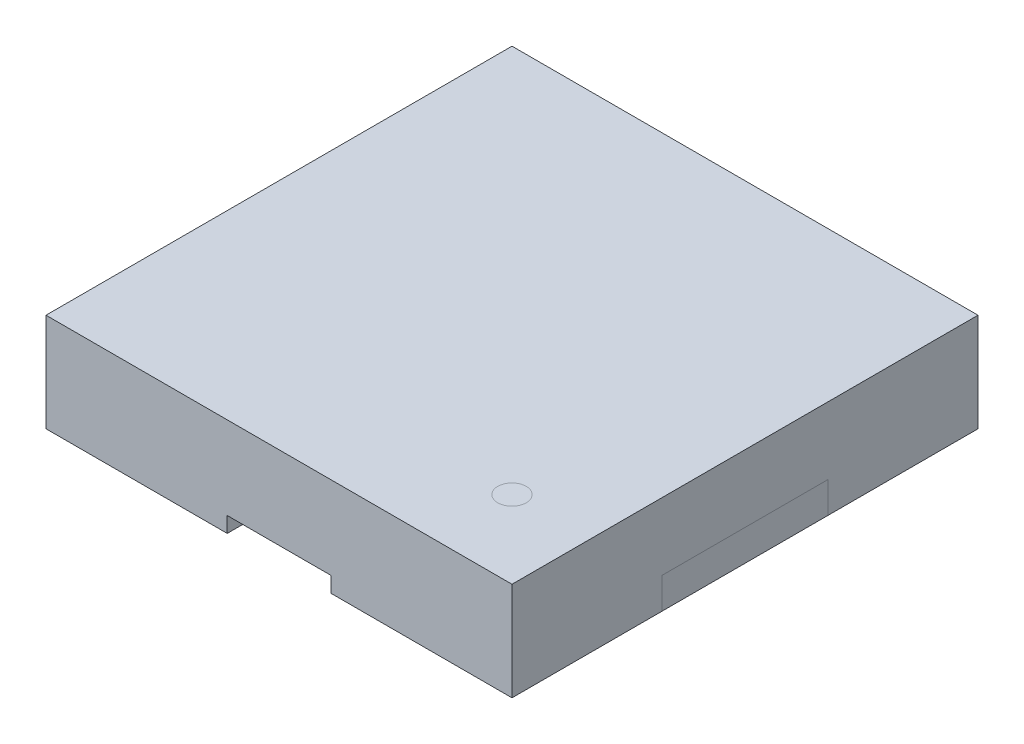
ISO-10303-21;
HEADER;
FILE_DESCRIPTION(('STEP AP214'),'2;1');
FILE_NAME('part.step','',(''),(''),'','','');
FILE_SCHEMA(('AUTOMOTIVE_DESIGN { 1 0 10303 214 1 1 1 1 }'));
ENDSEC;
DATA;
#1=APPLICATION_CONTEXT('core data for automotive mechanical design processes');
#2=APPLICATION_PROTOCOL_DEFINITION('international standard','automotive_design',2000,#1);
#3=PRODUCT_CONTEXT('',#1,'mechanical');
#4=PRODUCT('Part','Part','',(#3));
#5=PRODUCT_RELATED_PRODUCT_CATEGORY('part','',(#4));
#6=PRODUCT_DEFINITION_FORMATION('','',#4);
#7=PRODUCT_DEFINITION_CONTEXT('part definition',#1,'design');
#8=PRODUCT_DEFINITION('design','',#6,#7);
#9=PRODUCT_DEFINITION_SHAPE('','',#8);
#10=(LENGTH_UNIT() NAMED_UNIT(*) SI_UNIT(.MILLI.,.METRE.));
#11=(NAMED_UNIT(*) PLANE_ANGLE_UNIT() SI_UNIT($,.RADIAN.));
#12=(NAMED_UNIT(*) SI_UNIT($,.STERADIAN.) SOLID_ANGLE_UNIT());
#13=UNCERTAINTY_MEASURE_WITH_UNIT(LENGTH_MEASURE(1.E-05),#10,'distance_accuracy_value','');
#14=(GEOMETRIC_REPRESENTATION_CONTEXT(3) GLOBAL_UNCERTAINTY_ASSIGNED_CONTEXT((#13)) GLOBAL_UNIT_ASSIGNED_CONTEXT((#10,
#11,#12)) REPRESENTATION_CONTEXT('',''));
#15=CARTESIAN_POINT('',(0.,0.,0.));
#16=DIRECTION('',(0.,0.,1.));
#17=DIRECTION('',(1.,0.,0.));
#18=AXIS2_PLACEMENT_3D('',#15,#16,#17);
#19=CARTESIAN_POINT('',(-3.5,0.6,1.6));
#20=DIRECTION('',(-1.,0.,0.));
#21=DIRECTION('',(0.,0.,1.));
#22=AXIS2_PLACEMENT_3D('',#19,#20,#21);
#23=PLANE('',#22);
#24=DIRECTION('',(0.,0.,1.));
#25=VECTOR('',#24,1.);
#26=CARTESIAN_POINT('',(-3.5,0.6,-1.6));
#27=LINE('',#26,#25);
#28=CARTESIAN_POINT('',(-3.5,0.6,1.6));
#29=VERTEX_POINT('',#28);
#30=CARTESIAN_POINT('',(-3.50000000000001,0.6,-1.6));
#31=VERTEX_POINT('',#30);
#32=EDGE_CURVE('P0_E377',#29,#31,#27,.F.);
#33=ORIENTED_EDGE('',*,*,#32,.T.);
#34=DIRECTION('',(0.,1.,0.));
#35=VECTOR('',#34,1.);
#36=CARTESIAN_POINT('',(-3.5,0.6,-1.6));
#37=LINE('',#36,#35);
#38=CARTESIAN_POINT('',(-3.50000000000001,0.,-1.6));
#39=VERTEX_POINT('',#38);
#40=EDGE_CURVE('P0_E374',#39,#31,#37,.T.);
#41=ORIENTED_EDGE('',*,*,#40,.F.);
#42=DIRECTION('',(0.,0.,-1.));
#43=VECTOR('',#42,1.);
#44=CARTESIAN_POINT('',(-3.5,0.,-4.5));
#45=LINE('',#44,#43);
#46=CARTESIAN_POINT('',(-3.5,0.,1.6));
#47=VERTEX_POINT('',#46);
#48=EDGE_CURVE('P0_E347',#47,#39,#45,.T.);
#49=ORIENTED_EDGE('',*,*,#48,.F.);
#50=DIRECTION('',(0.,1.,0.));
#51=VECTOR('',#50,1.);
#52=CARTESIAN_POINT('',(-3.5,0.6,1.6));
#53=LINE('',#52,#51);
#54=EDGE_CURVE('P0_E209',#29,#47,#53,.F.);
#55=ORIENTED_EDGE('',*,*,#54,.F.);
#56=EDGE_LOOP('',(#33,#41,#49,#55));
#57=FACE_BOUND('',#56,.T.);
#58=ADVANCED_FACE('P0_F17',(#57),#23,.T.);
#59=CARTESIAN_POINT('',(-1.,0.3,-6.));
#60=DIRECTION('',(1.,0.,0.));
#61=DIRECTION('',(0.,0.,-1.));
#62=AXIS2_PLACEMENT_3D('',#59,#60,#61);
#63=PLANE('',#62);
#64=DIRECTION('',(0.,1.,0.));
#65=VECTOR('',#64,1.);
#66=CARTESIAN_POINT('',(-1.,0.3,-3.));
#67=LINE('',#66,#65);
#68=CARTESIAN_POINT('',(-1.,0.,-3.));
#69=VERTEX_POINT('',#68);
#70=CARTESIAN_POINT('',(-1.,0.3,-3.));
#71=VERTEX_POINT('',#70);
#72=EDGE_CURVE('P0_E227',#69,#71,#67,.T.);
#73=ORIENTED_EDGE('',*,*,#72,.F.);
#74=DIRECTION('',(0.,0.,-1.));
#75=VECTOR('',#74,1.);
#76=CARTESIAN_POINT('',(-1.,0.,-4.5));
#77=LINE('',#76,#75);
#78=CARTESIAN_POINT('',(-1.,0.,-4.5));
#79=VERTEX_POINT('',#78);
#80=EDGE_CURVE('P0_E341',#79,#69,#77,.F.);
#81=ORIENTED_EDGE('',*,*,#80,.F.);
#82=DIRECTION('',(0.,1.,0.));
#83=VECTOR('',#82,1.);
#84=CARTESIAN_POINT('',(-1.,0.3,-4.5));
#85=LINE('',#84,#83);
#86=CARTESIAN_POINT('',(-1.,0.3,-4.5));
#87=VERTEX_POINT('',#86);
#88=EDGE_CURVE('P0_E230',#79,#87,#85,.T.);
#89=ORIENTED_EDGE('',*,*,#88,.T.);
#90=DIRECTION('',(0.,0.,-1.));
#91=VECTOR('',#90,1.);
#92=CARTESIAN_POINT('',(-1.,0.3,-6.));
#93=LINE('',#92,#91);
#94=EDGE_CURVE('P0_E360',#71,#87,#93,.T.);
#95=ORIENTED_EDGE('',*,*,#94,.F.);
#96=EDGE_LOOP('',(#73,#81,#89,#95));
#97=FACE_BOUND('',#96,.T.);
#98=ADVANCED_FACE('P0_F449',(#97),#63,.T.);
#99=CARTESIAN_POINT('',(-1.,0.3,-3.));
#100=DIRECTION('',(0.,0.,-1.));
#101=DIRECTION('',(-1.,0.,0.));
#102=AXIS2_PLACEMENT_3D('',#99,#100,#101);
#103=PLANE('',#102);
#104=DIRECTION('',(1.,0.,0.));
#105=VECTOR('',#104,1.);
#106=CARTESIAN_POINT('',(1.,0.3,-3.));
#107=LINE('',#106,#105);
#108=CARTESIAN_POINT('',(1.,0.3,-3.));
#109=VERTEX_POINT('',#108);
#110=EDGE_CURVE('P0_E363',#109,#71,#107,.F.);
#111=ORIENTED_EDGE('',*,*,#110,.F.);
#112=DIRECTION('',(0.,1.,0.));
#113=VECTOR('',#112,1.);
#114=CARTESIAN_POINT('',(1.,0.3,-3.));
#115=LINE('',#114,#113);
#116=CARTESIAN_POINT('',(1.,0.,-3.));
#117=VERTEX_POINT('',#116);
#118=EDGE_CURVE('P0_E221',#117,#109,#115,.T.);
#119=ORIENTED_EDGE('',*,*,#118,.F.);
#120=DIRECTION('',(1.,0.,0.));
#121=VECTOR('',#120,1.);
#122=CARTESIAN_POINT('',(4.5,0.,-3.));
#123=LINE('',#122,#121);
#124=EDGE_CURVE('P0_E338',#69,#117,#123,.T.);
#125=ORIENTED_EDGE('',*,*,#124,.F.);
#126=ORIENTED_EDGE('',*,*,#72,.T.);
#127=EDGE_LOOP('',(#111,#119,#125,#126));
#128=FACE_BOUND('',#127,.T.);
#129=ADVANCED_FACE('P0_F453',(#128),#103,.T.);
#130=CARTESIAN_POINT('',(1.,0.3,-6.));
#131=DIRECTION('',(-1.,0.,0.));
#132=DIRECTION('',(0.,0.,1.));
#133=AXIS2_PLACEMENT_3D('',#130,#131,#132);
#134=PLANE('',#133);
#135=ORIENTED_EDGE('',*,*,#118,.T.);
#136=DIRECTION('',(0.,0.,-1.));
#137=VECTOR('',#136,1.);
#138=CARTESIAN_POINT('',(1.,0.3,-6.));
#139=LINE('',#138,#137);
#140=CARTESIAN_POINT('',(1.,0.3,-4.5));
#141=VERTEX_POINT('',#140);
#142=EDGE_CURVE('P0_E367',#141,#109,#139,.F.);
#143=ORIENTED_EDGE('',*,*,#142,.F.);
#144=DIRECTION('',(0.,1.,0.));
#145=VECTOR('',#144,1.);
#146=CARTESIAN_POINT('',(1.,0.3,-4.5));
#147=LINE('',#146,#145);
#148=CARTESIAN_POINT('',(1.,0.,-4.5));
#149=VERTEX_POINT('',#148);
#150=EDGE_CURVE('P0_E224',#141,#149,#147,.F.);
#151=ORIENTED_EDGE('',*,*,#150,.T.);
#152=DIRECTION('',(0.,0.,-1.));
#153=VECTOR('',#152,1.);
#154=CARTESIAN_POINT('',(1.,0.,-4.5));
#155=LINE('',#154,#153);
#156=EDGE_CURVE('P0_E334',#117,#149,#155,.T.);
#157=ORIENTED_EDGE('',*,*,#156,.F.);
#158=EDGE_LOOP('',(#135,#143,#151,#157));
#159=FACE_BOUND('',#158,.T.);
#160=ADVANCED_FACE('P0_F441',(#159),#134,.T.);
#161=CARTESIAN_POINT('',(3.5,0.6,1.6));
#162=DIRECTION('',(1.,0.,0.));
#163=DIRECTION('',(0.,0.,-1.));
#164=AXIS2_PLACEMENT_3D('',#161,#162,#163);
#165=PLANE('',#164);
#166=DIRECTION('',(0.,0.,-1.));
#167=VECTOR('',#166,1.);
#168=CARTESIAN_POINT('',(3.5,0.6,-1.6));
#169=LINE('',#168,#167);
#170=CARTESIAN_POINT('',(3.5,0.6,1.6));
#171=VERTEX_POINT('',#170);
#172=CARTESIAN_POINT('',(3.5,0.6,-1.6));
#173=VERTEX_POINT('',#172);
#174=EDGE_CURVE('P0_E356',#171,#173,#169,.T.);
#175=ORIENTED_EDGE('',*,*,#174,.F.);
#176=DIRECTION('',(0.,1.,0.));
#177=VECTOR('',#176,1.);
#178=CARTESIAN_POINT('',(3.5,0.6,1.6));
#179=LINE('',#178,#177);
#180=CARTESIAN_POINT('',(3.5,0.,1.6));
#181=VERTEX_POINT('',#180);
#182=EDGE_CURVE('P0_E353',#181,#171,#179,.T.);
#183=ORIENTED_EDGE('',*,*,#182,.F.);
#184=DIRECTION('',(0.,0.,-1.));
#185=VECTOR('',#184,1.);
#186=CARTESIAN_POINT('',(3.5,0.,-4.5));
#187=LINE('',#186,#185);
#188=CARTESIAN_POINT('',(3.5,0.,-1.6));
#189=VERTEX_POINT('',#188);
#190=EDGE_CURVE('P0_E331',#189,#181,#187,.F.);
#191=ORIENTED_EDGE('',*,*,#190,.F.);
#192=DIRECTION('',(0.,1.,0.));
#193=VECTOR('',#192,1.);
#194=CARTESIAN_POINT('',(3.5,0.6,-1.6));
#195=LINE('',#194,#193);
#196=EDGE_CURVE('P0_E218',#189,#173,#195,.T.);
#197=ORIENTED_EDGE('',*,*,#196,.T.);
#198=EDGE_LOOP('',(#175,#183,#191,#197));
#199=FACE_BOUND('',#198,.T.);
#200=ADVANCED_FACE('P0_F435',(#199),#165,.T.);
#201=CARTESIAN_POINT('',(1.,0.3,6.));
#202=DIRECTION('',(-1.,0.,0.));
#203=DIRECTION('',(0.,0.,1.));
#204=AXIS2_PLACEMENT_3D('',#201,#202,#203);
#205=PLANE('',#204);
#206=DIRECTION('',(0.,1.,0.));
#207=VECTOR('',#206,1.);
#208=CARTESIAN_POINT('',(1.,0.3,3.));
#209=LINE('',#208,#207);
#210=CARTESIAN_POINT('',(1.,0.,3.));
#211=VERTEX_POINT('',#210);
#212=CARTESIAN_POINT('',(1.,0.3,3.));
#213=VERTEX_POINT('',#212);
#214=EDGE_CURVE('P0_E178',#211,#213,#209,.T.);
#215=ORIENTED_EDGE('',*,*,#214,.F.);
#216=DIRECTION('',(0.,0.,-1.));
#217=VECTOR('',#216,1.);
#218=CARTESIAN_POINT('',(1.,0.,-4.5));
#219=LINE('',#218,#217);
#220=CARTESIAN_POINT('',(1.,0.,4.5));
#221=VERTEX_POINT('',#220);
#222=EDGE_CURVE('P0_E326',#221,#211,#219,.T.);
#223=ORIENTED_EDGE('',*,*,#222,.F.);
#224=DIRECTION('',(0.,1.,0.));
#225=VECTOR('',#224,1.);
#226=CARTESIAN_POINT('',(1.,0.3,4.5));
#227=LINE('',#226,#225);
#228=CARTESIAN_POINT('',(1.,0.3,4.5));
#229=VERTEX_POINT('',#228);
#230=EDGE_CURVE('P0_E216',#221,#229,#227,.T.);
#231=ORIENTED_EDGE('',*,*,#230,.T.);
#232=DIRECTION('',(0.,0.,-1.));
#233=VECTOR('',#232,1.);
#234=CARTESIAN_POINT('',(1.,0.3,3.));
#235=LINE('',#234,#233);
#236=EDGE_CURVE('P0_E204',#213,#229,#235,.F.);
#237=ORIENTED_EDGE('',*,*,#236,.F.);
#238=EDGE_LOOP('',(#215,#223,#231,#237));
#239=FACE_BOUND('',#238,.T.);
#240=ADVANCED_FACE('P0_F508',(#239),#205,.T.);
#241=CARTESIAN_POINT('',(-1.,0.3,3.));
#242=DIRECTION('',(0.,0.,1.));
#243=DIRECTION('',(1.,0.,0.));
#244=AXIS2_PLACEMENT_3D('',#241,#242,#243);
#245=PLANE('',#244);
#246=DIRECTION('',(1.,0.,0.));
#247=VECTOR('',#246,1.);
#248=CARTESIAN_POINT('',(1.,0.3,3.));
#249=LINE('',#248,#247);
#250=CARTESIAN_POINT('',(-1.,0.3,3.));
#251=VERTEX_POINT('',#250);
#252=EDGE_CURVE('P0_E197',#251,#213,#249,.T.);
#253=ORIENTED_EDGE('',*,*,#252,.F.);
#254=DIRECTION('',(0.,1.,0.));
#255=VECTOR('',#254,1.);
#256=CARTESIAN_POINT('',(-1.,0.3,3.));
#257=LINE('',#256,#255);
#258=CARTESIAN_POINT('',(-1.,0.,3.));
#259=VERTEX_POINT('',#258);
#260=EDGE_CURVE('P0_E185',#259,#251,#257,.T.);
#261=ORIENTED_EDGE('',*,*,#260,.F.);
#262=DIRECTION('',(1.,0.,0.));
#263=VECTOR('',#262,1.);
#264=CARTESIAN_POINT('',(4.5,0.,3.));
#265=LINE('',#264,#263);
#266=EDGE_CURVE('P0_E323',#211,#259,#265,.F.);
#267=ORIENTED_EDGE('',*,*,#266,.F.);
#268=ORIENTED_EDGE('',*,*,#214,.T.);
#269=EDGE_LOOP('',(#253,#261,#267,#268));
#270=FACE_BOUND('',#269,.T.);
#271=ADVANCED_FACE('P0_F202',(#270),#245,.T.);
#272=CARTESIAN_POINT('',(-1.,0.3,6.));
#273=DIRECTION('',(1.,0.,0.));
#274=DIRECTION('',(0.,0.,-1.));
#275=AXIS2_PLACEMENT_3D('',#272,#273,#274);
#276=PLANE('',#275);
#277=ORIENTED_EDGE('',*,*,#260,.T.);
#278=DIRECTION('',(0.,0.,-1.));
#279=VECTOR('',#278,1.);
#280=CARTESIAN_POINT('',(-1.,0.3,3.));
#281=LINE('',#280,#279);
#282=CARTESIAN_POINT('',(-1.,0.3,4.5));
#283=VERTEX_POINT('',#282);
#284=EDGE_CURVE('P0_E188',#283,#251,#281,.T.);
#285=ORIENTED_EDGE('',*,*,#284,.F.);
#286=DIRECTION('',(0.,1.,0.));
#287=VECTOR('',#286,1.);
#288=CARTESIAN_POINT('',(-1.,0.3,4.5));
#289=LINE('',#288,#287);
#290=CARTESIAN_POINT('',(-1.,0.,4.5));
#291=VERTEX_POINT('',#290);
#292=EDGE_CURVE('P0_E192',#283,#291,#289,.F.);
#293=ORIENTED_EDGE('',*,*,#292,.T.);
#294=DIRECTION('',(0.,0.,-1.));
#295=VECTOR('',#294,1.);
#296=CARTESIAN_POINT('',(-1.,0.,-4.5));
#297=LINE('',#296,#295);
#298=EDGE_CURVE('P0_E191',#259,#291,#297,.F.);
#299=ORIENTED_EDGE('',*,*,#298,.F.);
#300=EDGE_LOOP('',(#277,#285,#293,#299));
#301=FACE_BOUND('',#300,.T.);
#302=ADVANCED_FACE('P0_F187',(#301),#276,.T.);
#303=CARTESIAN_POINT('',(3.,1.6,3.));
#304=DIRECTION('',(0.,1.,0.));
#305=DIRECTION('',(0.,0.,1.));
#306=AXIS2_PLACEMENT_3D('',#303,#304,#305);
#307=PLANE('',#306);
#308=CARTESIAN_POINT('',(3.,1.6,3.));
#309=DIRECTION('',(0.,1.,0.));
#310=DIRECTION('',(0.,0.,1.));
#311=AXIS2_PLACEMENT_3D('',#308,#309,#310);
#312=CIRCLE('',#311,0.275);
#313=CARTESIAN_POINT('',(3.,1.6,3.275));
#314=VERTEX_POINT('',#313);
#315=EDGE_CURVE('P0_E20',#314,#314,#312,.T.);
#316=ORIENTED_EDGE('',*,*,#315,.T.);
#317=EDGE_LOOP('',(#316));
#318=FACE_BOUND('',#317,.T.);
#319=ADVANCED_FACE('P0_F500',(#318),#307,.T.);
#320=CARTESIAN_POINT('',(1.,0.3,3.));
#321=DIRECTION('',(0.,-1.,0.));
#322=DIRECTION('',(0.,0.,-1.));
#323=AXIS2_PLACEMENT_3D('',#320,#321,#322);
#324=PLANE('',#323);
#325=ORIENTED_EDGE('',*,*,#252,.T.);
#326=ORIENTED_EDGE('',*,*,#236,.T.);
#327=DIRECTION('',(-1.,0.,0.));
#328=VECTOR('',#327,1.);
#329=CARTESIAN_POINT('',(-4.5,0.3,4.5));
#330=LINE('',#329,#328);
#331=EDGE_CURVE('P0_E200',#229,#283,#330,.T.);
#332=ORIENTED_EDGE('',*,*,#331,.T.);
#333=ORIENTED_EDGE('',*,*,#284,.T.);
#334=EDGE_LOOP('',(#325,#326,#332,#333));
#335=FACE_BOUND('',#334,.T.);
#336=ADVANCED_FACE('P0_F195',(#335),#324,.T.);
#337=CARTESIAN_POINT('',(-3.5,0.6,1.6));
#338=DIRECTION('',(0.,0.,-1.));
#339=DIRECTION('',(-1.,0.,0.));
#340=AXIS2_PLACEMENT_3D('',#337,#338,#339);
#341=PLANE('',#340);
#342=DIRECTION('',(1.,0.,0.));
#343=VECTOR('',#342,1.);
#344=CARTESIAN_POINT('',(-3.5,0.6,1.6));
#345=LINE('',#344,#343);
#346=CARTESIAN_POINT('',(-4.5,0.6,1.6));
#347=VERTEX_POINT('',#346);
#348=EDGE_CURVE('P0_E381',#347,#29,#345,.T.);
#349=ORIENTED_EDGE('',*,*,#348,.T.);
#350=ORIENTED_EDGE('',*,*,#54,.T.);
#351=DIRECTION('',(1.,0.,0.));
#352=VECTOR('',#351,1.);
#353=CARTESIAN_POINT('',(4.5,0.,1.6));
#354=LINE('',#353,#352);
#355=CARTESIAN_POINT('',(-4.5,0.,1.6));
#356=VERTEX_POINT('',#355);
#357=EDGE_CURVE('P0_E319',#356,#47,#354,.T.);
#358=ORIENTED_EDGE('',*,*,#357,.F.);
#359=DIRECTION('',(0.,1.,0.));
#360=VECTOR('',#359,1.);
#361=CARTESIAN_POINT('',(-4.5,1.9,1.6));
#362=LINE('',#361,#360);
#363=EDGE_CURVE('P0_E295',#356,#347,#362,.T.);
#364=ORIENTED_EDGE('',*,*,#363,.T.);
#365=EDGE_LOOP('',(#349,#350,#358,#364));
#366=FACE_BOUND('',#365,.T.);
#367=ADVANCED_FACE('P0_F384',(#366),#341,.T.);
#368=CARTESIAN_POINT('',(-3.5,0.6,-1.6));
#369=DIRECTION('',(0.,1.,0.));
#370=DIRECTION('',(0.,0.,1.));
#371=AXIS2_PLACEMENT_3D('',#368,#369,#370);
#372=PLANE('',#371);
#373=ORIENTED_EDGE('',*,*,#348,.F.);
#374=DIRECTION('',(0.,0.,-1.));
#375=VECTOR('',#374,1.);
#376=CARTESIAN_POINT('',(-4.5,0.6,4.5));
#377=LINE('',#376,#375);
#378=CARTESIAN_POINT('',(-4.5,0.6,-1.6));
#379=VERTEX_POINT('',#378);
#380=EDGE_CURVE('P0_E292',#347,#379,#377,.T.);
#381=ORIENTED_EDGE('',*,*,#380,.T.);
#382=DIRECTION('',(1.,0.,0.));
#383=VECTOR('',#382,1.);
#384=CARTESIAN_POINT('',(-3.5,0.6,-1.6));
#385=LINE('',#384,#383);
#386=EDGE_CURVE('P0_E371',#31,#379,#385,.F.);
#387=ORIENTED_EDGE('',*,*,#386,.F.);
#388=ORIENTED_EDGE('',*,*,#32,.F.);
#389=EDGE_LOOP('',(#373,#381,#387,#388));
#390=FACE_BOUND('',#389,.T.);
#391=ADVANCED_FACE('P0_F492',(#390),#372,.F.);
#392=CARTESIAN_POINT('',(-3.5,0.6,-1.6));
#393=DIRECTION('',(0.,0.,1.));
#394=DIRECTION('',(1.,0.,0.));
#395=AXIS2_PLACEMENT_3D('',#392,#393,#394);
#396=PLANE('',#395);
#397=ORIENTED_EDGE('',*,*,#386,.T.);
#398=DIRECTION('',(0.,1.,0.));
#399=VECTOR('',#398,1.);
#400=CARTESIAN_POINT('',(-4.5,1.9,-1.6));
#401=LINE('',#400,#399);
#402=CARTESIAN_POINT('',(-4.5,0.,-1.6));
#403=VERTEX_POINT('',#402);
#404=EDGE_CURVE('P0_E289',#379,#403,#401,.F.);
#405=ORIENTED_EDGE('',*,*,#404,.T.);
#406=DIRECTION('',(1.,0.,0.));
#407=VECTOR('',#406,1.);
#408=CARTESIAN_POINT('',(4.5,0.,-1.6));
#409=LINE('',#408,#407);
#410=EDGE_CURVE('P0_E344',#39,#403,#409,.F.);
#411=ORIENTED_EDGE('',*,*,#410,.F.);
#412=ORIENTED_EDGE('',*,*,#40,.T.);
#413=EDGE_LOOP('',(#397,#405,#411,#412));
#414=FACE_BOUND('',#413,.T.);
#415=ADVANCED_FACE('P0_F396',(#414),#396,.T.);
#416=CARTESIAN_POINT('',(1.,0.3,-6.));
#417=DIRECTION('',(0.,-1.,0.));
#418=DIRECTION('',(0.,0.,-1.));
#419=AXIS2_PLACEMENT_3D('',#416,#417,#418);
#420=PLANE('',#419);
#421=ORIENTED_EDGE('',*,*,#110,.T.);
#422=ORIENTED_EDGE('',*,*,#94,.T.);
#423=DIRECTION('',(1.,0.,0.));
#424=VECTOR('',#423,1.);
#425=CARTESIAN_POINT('',(-4.5,0.3,-4.5));
#426=LINE('',#425,#424);
#427=EDGE_CURVE('P0_E285',#87,#141,#426,.T.);
#428=ORIENTED_EDGE('',*,*,#427,.T.);
#429=ORIENTED_EDGE('',*,*,#142,.T.);
#430=EDGE_LOOP('',(#421,#422,#428,#429));
#431=FACE_BOUND('',#430,.T.);
#432=ADVANCED_FACE('P0_F445',(#431),#420,.T.);
#433=CARTESIAN_POINT('',(4.5,0.6,-1.6));
#434=DIRECTION('',(0.,-1.,0.));
#435=DIRECTION('',(0.,0.,-1.));
#436=AXIS2_PLACEMENT_3D('',#433,#434,#435);
#437=PLANE('',#436);
#438=ORIENTED_EDGE('',*,*,#174,.T.);
#439=DIRECTION('',(1.,0.,0.));
#440=VECTOR('',#439,1.);
#441=CARTESIAN_POINT('',(3.5,0.6,-1.6));
#442=LINE('',#441,#440);
#443=CARTESIAN_POINT('',(4.5,0.6,-1.6));
#444=VERTEX_POINT('',#443);
#445=EDGE_CURVE('P0_E313',#444,#173,#442,.F.);
#446=ORIENTED_EDGE('',*,*,#445,.F.);
#447=DIRECTION('',(0.,0.,1.));
#448=VECTOR('',#447,1.);
#449=CARTESIAN_POINT('',(4.5,0.6,4.5));
#450=LINE('',#449,#448);
#451=CARTESIAN_POINT('',(4.5,0.6,1.6));
#452=VERTEX_POINT('',#451);
#453=EDGE_CURVE('P0_E271',#444,#452,#450,.T.);
#454=ORIENTED_EDGE('',*,*,#453,.T.);
#455=DIRECTION('',(-1.,0.,0.));
#456=VECTOR('',#455,1.);
#457=CARTESIAN_POINT('',(3.5,0.6,1.6));
#458=LINE('',#457,#456);
#459=EDGE_CURVE('P0_E350',#171,#452,#458,.F.);
#460=ORIENTED_EDGE('',*,*,#459,.F.);
#461=EDGE_LOOP('',(#438,#446,#454,#460));
#462=FACE_BOUND('',#461,.T.);
#463=ADVANCED_FACE('P0_F432',(#462),#437,.T.);
#464=CARTESIAN_POINT('',(3.5,0.6,1.6));
#465=DIRECTION('',(0.,0.,-1.));
#466=DIRECTION('',(-1.,0.,0.));
#467=AXIS2_PLACEMENT_3D('',#464,#465,#466);
#468=PLANE('',#467);
#469=ORIENTED_EDGE('',*,*,#459,.T.);
#470=DIRECTION('',(0.,1.,0.));
#471=VECTOR('',#470,1.);
#472=CARTESIAN_POINT('',(4.5,1.9,1.6));
#473=LINE('',#472,#471);
#474=CARTESIAN_POINT('',(4.5,0.,1.6));
#475=VERTEX_POINT('',#474);
#476=EDGE_CURVE('P0_E267',#452,#475,#473,.F.);
#477=ORIENTED_EDGE('',*,*,#476,.T.);
#478=DIRECTION('',(1.,0.,0.));
#479=VECTOR('',#478,1.);
#480=CARTESIAN_POINT('',(4.5,0.,1.6));
#481=LINE('',#480,#479);
#482=EDGE_CURVE('P0_E328',#181,#475,#481,.T.);
#483=ORIENTED_EDGE('',*,*,#482,.F.);
#484=ORIENTED_EDGE('',*,*,#182,.T.);
#485=EDGE_LOOP('',(#469,#477,#483,#484));
#486=FACE_BOUND('',#485,.T.);
#487=ADVANCED_FACE('P0_F427',(#486),#468,.T.);
#488=CARTESIAN_POINT('',(4.5,0.,-4.5));
#489=DIRECTION('',(0.,-1.,0.));
#490=DIRECTION('',(0.,0.,-1.));
#491=AXIS2_PLACEMENT_3D('',#488,#489,#490);
#492=PLANE('',#491);
#493=DIRECTION('',(0.,0.,-1.));
#494=VECTOR('',#493,1.);
#495=CARTESIAN_POINT('',(-4.5,0.,4.5));
#496=LINE('',#495,#494);
#497=CARTESIAN_POINT('',(-4.5,0.,4.5));
#498=VERTEX_POINT('',#497);
#499=EDGE_CURVE('P0_E298',#498,#356,#496,.T.);
#500=ORIENTED_EDGE('',*,*,#499,.T.);
#501=ORIENTED_EDGE('',*,*,#357,.T.);
#502=ORIENTED_EDGE('',*,*,#48,.T.);
#503=ORIENTED_EDGE('',*,*,#410,.T.);
#504=DIRECTION('',(0.,0.,-1.));
#505=VECTOR('',#504,1.);
#506=CARTESIAN_POINT('',(-4.5,0.,4.5));
#507=LINE('',#506,#505);
#508=CARTESIAN_POINT('',(-4.5,0.,-4.5));
#509=VERTEX_POINT('',#508);
#510=EDGE_CURVE('P0_E304',#403,#509,#507,.T.);
#511=ORIENTED_EDGE('',*,*,#510,.T.);
#512=DIRECTION('',(1.,0.,0.));
#513=VECTOR('',#512,1.);
#514=CARTESIAN_POINT('',(-4.5,0.,-4.5));
#515=LINE('',#514,#513);
#516=EDGE_CURVE('P0_E274',#509,#79,#515,.T.);
#517=ORIENTED_EDGE('',*,*,#516,.T.);
#518=ORIENTED_EDGE('',*,*,#80,.T.);
#519=ORIENTED_EDGE('',*,*,#124,.T.);
#520=ORIENTED_EDGE('',*,*,#156,.T.);
#521=DIRECTION('',(1.,0.,0.));
#522=VECTOR('',#521,1.);
#523=CARTESIAN_POINT('',(-4.5,0.,-4.5));
#524=LINE('',#523,#522);
#525=CARTESIAN_POINT('',(4.5,0.,-4.5));
#526=VERTEX_POINT('',#525);
#527=EDGE_CURVE('P0_E282',#149,#526,#524,.T.);
#528=ORIENTED_EDGE('',*,*,#527,.T.);
#529=DIRECTION('',(0.,0.,1.));
#530=VECTOR('',#529,1.);
#531=CARTESIAN_POINT('',(4.5,0.,4.5));
#532=LINE('',#531,#530);
#533=CARTESIAN_POINT('',(4.5,0.,-1.6));
#534=VERTEX_POINT('',#533);
#535=EDGE_CURVE('P0_E246',#526,#534,#532,.T.);
#536=ORIENTED_EDGE('',*,*,#535,.T.);
#537=DIRECTION('',(1.,0.,0.));
#538=VECTOR('',#537,1.);
#539=CARTESIAN_POINT('',(3.5,0.,-1.6));
#540=LINE('',#539,#538);
#541=EDGE_CURVE('P0_E316',#189,#534,#540,.T.);
#542=ORIENTED_EDGE('',*,*,#541,.F.);
#543=ORIENTED_EDGE('',*,*,#190,.T.);
#544=ORIENTED_EDGE('',*,*,#482,.T.);
#545=DIRECTION('',(0.,0.,1.));
#546=VECTOR('',#545,1.);
#547=CARTESIAN_POINT('',(4.5,0.,4.5));
#548=LINE('',#547,#546);
#549=CARTESIAN_POINT('',(4.5,0.,4.5));
#550=VERTEX_POINT('',#549);
#551=EDGE_CURVE('P0_E263',#475,#550,#548,.T.);
#552=ORIENTED_EDGE('',*,*,#551,.T.);
#553=DIRECTION('',(-1.,0.,0.));
#554=VECTOR('',#553,1.);
#555=CARTESIAN_POINT('',(-4.5,0.,4.5));
#556=LINE('',#555,#554);
#557=EDGE_CURVE('P0_E307',#550,#221,#556,.T.);
#558=ORIENTED_EDGE('',*,*,#557,.T.);
#559=ORIENTED_EDGE('',*,*,#222,.T.);
#560=ORIENTED_EDGE('',*,*,#266,.T.);
#561=ORIENTED_EDGE('',*,*,#298,.T.);
#562=DIRECTION('',(-1.,0.,0.));
#563=VECTOR('',#562,1.);
#564=CARTESIAN_POINT('',(-4.5,0.,4.5));
#565=LINE('',#564,#563);
#566=EDGE_CURVE('P0_E310',#291,#498,#565,.T.);
#567=ORIENTED_EDGE('',*,*,#566,.T.);
#568=EDGE_LOOP('',(#500,#501,#502,#503,#511,#517,#518,#519,#520,#528,#536,#542,#543,#544,#552,
#558,#559,#560,#561,#567));
#569=FACE_BOUND('',#568,.T.);
#570=ADVANCED_FACE('P0_F390',(#569),#492,.T.);
#571=CARTESIAN_POINT('',(3.5,0.6,-1.6));
#572=DIRECTION('',(0.,0.,1.));
#573=DIRECTION('',(1.,0.,0.));
#574=AXIS2_PLACEMENT_3D('',#571,#572,#573);
#575=PLANE('',#574);
#576=ORIENTED_EDGE('',*,*,#445,.T.);
#577=ORIENTED_EDGE('',*,*,#196,.F.);
#578=ORIENTED_EDGE('',*,*,#541,.T.);
#579=DIRECTION('',(0.,1.,0.));
#580=VECTOR('',#579,1.);
#581=CARTESIAN_POINT('',(4.5,1.9,-1.6));
#582=LINE('',#581,#580);
#583=EDGE_CURVE('P0_E236',#534,#444,#582,.T.);
#584=ORIENTED_EDGE('',*,*,#583,.T.);
#585=EDGE_LOOP('',(#576,#577,#578,#584));
#586=FACE_BOUND('',#585,.T.);
#587=ADVANCED_FACE('P0_F433',(#586),#575,.T.);
#588=CARTESIAN_POINT('',(3.,1.6,3.));
#589=DIRECTION('',(0.,1.,0.));
#590=DIRECTION('',(0.,0.,1.));
#591=AXIS2_PLACEMENT_3D('',#588,#589,#590);
#592=CYLINDRICAL_SURFACE('',#591,0.275);
#593=ORIENTED_EDGE('',*,*,#315,.F.);
#594=EDGE_LOOP('',(#593));
#595=FACE_BOUND('',#594,.T.);
#596=CARTESIAN_POINT('',(3.,1.9,3.));
#597=DIRECTION('',(0.,1.,0.));
#598=DIRECTION('',(0.,0.,1.));
#599=AXIS2_PLACEMENT_3D('',#596,#597,#598);
#600=CIRCLE('',#599,0.275);
#601=CARTESIAN_POINT('',(3.,1.9,3.275));
#602=VERTEX_POINT('',#601);
#603=EDGE_CURVE('P0_E232',#602,#602,#600,.T.);
#604=ORIENTED_EDGE('',*,*,#603,.T.);
#605=EDGE_LOOP('',(#604));
#606=FACE_BOUND('',#605,.T.);
#607=ADVANCED_FACE('P0_F476',(#595,#606),#592,.F.);
#608=CARTESIAN_POINT('',(-4.5,1.9,4.5));
#609=DIRECTION('',(0.,0.,-1.));
#610=DIRECTION('',(-1.,0.,0.));
#611=AXIS2_PLACEMENT_3D('',#608,#609,#610);
#612=PLANE('',#611);
#613=ORIENTED_EDGE('',*,*,#557,.F.);
#614=DIRECTION('',(0.,1.,0.));
#615=VECTOR('',#614,1.);
#616=CARTESIAN_POINT('',(4.5,1.9,4.5));
#617=LINE('',#616,#615);
#618=CARTESIAN_POINT('',(4.5,1.9,4.5));
#619=VERTEX_POINT('',#618);
#620=EDGE_CURVE('P0_E260',#550,#619,#617,.T.);
#621=ORIENTED_EDGE('',*,*,#620,.T.);
#622=DIRECTION('',(1.,0.,0.));
#623=VECTOR('',#622,1.);
#624=CARTESIAN_POINT('',(4.5,1.9,4.5));
#625=LINE('',#624,#623);
#626=CARTESIAN_POINT('',(-4.5,1.9,4.5));
#627=VERTEX_POINT('',#626);
#628=EDGE_CURVE('P0_E235',#619,#627,#625,.F.);
#629=ORIENTED_EDGE('',*,*,#628,.T.);
#630=DIRECTION('',(0.,1.,0.));
#631=VECTOR('',#630,1.);
#632=CARTESIAN_POINT('',(-4.5,1.9,4.5));
#633=LINE('',#632,#631);
#634=EDGE_CURVE('P0_E301',#627,#498,#633,.F.);
#635=ORIENTED_EDGE('',*,*,#634,.T.);
#636=ORIENTED_EDGE('',*,*,#566,.F.);
#637=ORIENTED_EDGE('',*,*,#292,.F.);
#638=ORIENTED_EDGE('',*,*,#331,.F.);
#639=ORIENTED_EDGE('',*,*,#230,.F.);
#640=EDGE_LOOP('',(#613,#621,#629,#635,#636,#637,#638,#639));
#641=FACE_BOUND('',#640,.T.);
#642=ADVANCED_FACE('P0_F473',(#641),#612,.F.);
#643=CARTESIAN_POINT('',(-4.5,1.9,4.5));
#644=DIRECTION('',(1.,0.,0.));
#645=DIRECTION('',(0.,0.,-1.));
#646=AXIS2_PLACEMENT_3D('',#643,#644,#645);
#647=PLANE('',#646);
#648=ORIENTED_EDGE('',*,*,#380,.F.);
#649=ORIENTED_EDGE('',*,*,#363,.F.);
#650=ORIENTED_EDGE('',*,*,#499,.F.);
#651=ORIENTED_EDGE('',*,*,#634,.F.);
#652=DIRECTION('',(0.,0.,-1.));
#653=VECTOR('',#652,1.);
#654=CARTESIAN_POINT('',(-4.5,1.9,-4.5));
#655=LINE('',#654,#653);
#656=CARTESIAN_POINT('',(-4.5,1.9,-4.5));
#657=VERTEX_POINT('',#656);
#658=EDGE_CURVE('P0_E242',#627,#657,#655,.T.);
#659=ORIENTED_EDGE('',*,*,#658,.T.);
#660=DIRECTION('',(0.,1.,0.));
#661=VECTOR('',#660,1.);
#662=CARTESIAN_POINT('',(-4.5,1.9,-4.5));
#663=LINE('',#662,#661);
#664=EDGE_CURVE('P0_E278',#657,#509,#663,.F.);
#665=ORIENTED_EDGE('',*,*,#664,.T.);
#666=ORIENTED_EDGE('',*,*,#510,.F.);
#667=ORIENTED_EDGE('',*,*,#404,.F.);
#668=EDGE_LOOP('',(#648,#649,#650,#651,#659,#665,#666,#667));
#669=FACE_BOUND('',#668,.T.);
#670=ADVANCED_FACE('P0_F402',(#669),#647,.F.);
#671=CARTESIAN_POINT('',(-4.5,1.9,-4.5));
#672=DIRECTION('',(0.,0.,1.));
#673=DIRECTION('',(1.,0.,0.));
#674=AXIS2_PLACEMENT_3D('',#671,#672,#673);
#675=PLANE('',#674);
#676=ORIENTED_EDGE('',*,*,#516,.F.);
#677=ORIENTED_EDGE('',*,*,#664,.F.);
#678=DIRECTION('',(1.,0.,0.));
#679=VECTOR('',#678,1.);
#680=CARTESIAN_POINT('',(4.5,1.9,-4.5));
#681=LINE('',#680,#679);
#682=CARTESIAN_POINT('',(4.5,1.9,-4.5));
#683=VERTEX_POINT('',#682);
#684=EDGE_CURVE('P0_E27',#657,#683,#681,.T.);
#685=ORIENTED_EDGE('',*,*,#684,.T.);
#686=DIRECTION('',(0.,1.,0.));
#687=VECTOR('',#686,1.);
#688=CARTESIAN_POINT('',(4.5,1.9,-4.5));
#689=LINE('',#688,#687);
#690=EDGE_CURVE('P0_E39',#683,#526,#689,.F.);
#691=ORIENTED_EDGE('',*,*,#690,.T.);
#692=ORIENTED_EDGE('',*,*,#527,.F.);
#693=ORIENTED_EDGE('',*,*,#150,.F.);
#694=ORIENTED_EDGE('',*,*,#427,.F.);
#695=ORIENTED_EDGE('',*,*,#88,.F.);
#696=EDGE_LOOP('',(#676,#677,#685,#691,#692,#693,#694,#695));
#697=FACE_BOUND('',#696,.T.);
#698=ADVANCED_FACE('P0_F408',(#697),#675,.F.);
#699=CARTESIAN_POINT('',(4.5,1.9,4.5));
#700=DIRECTION('',(-1.,0.,0.));
#701=DIRECTION('',(0.,0.,1.));
#702=AXIS2_PLACEMENT_3D('',#699,#700,#701);
#703=PLANE('',#702);
#704=ORIENTED_EDGE('',*,*,#535,.F.);
#705=ORIENTED_EDGE('',*,*,#690,.F.);
#706=DIRECTION('',(0.,0.,-1.));
#707=VECTOR('',#706,1.);
#708=CARTESIAN_POINT('',(4.5,1.9,-4.5));
#709=LINE('',#708,#707);
#710=EDGE_CURVE('P0_E11',#683,#619,#709,.F.);
#711=ORIENTED_EDGE('',*,*,#710,.T.);
#712=ORIENTED_EDGE('',*,*,#620,.F.);
#713=ORIENTED_EDGE('',*,*,#551,.F.);
#714=ORIENTED_EDGE('',*,*,#476,.F.);
#715=ORIENTED_EDGE('',*,*,#453,.F.);
#716=ORIENTED_EDGE('',*,*,#583,.F.);
#717=EDGE_LOOP('',(#704,#705,#711,#712,#713,#714,#715,#716));
#718=FACE_BOUND('',#717,.T.);
#719=ADVANCED_FACE('P0_F418',(#718),#703,.F.);
#720=CARTESIAN_POINT('',(4.5,1.9,-4.5));
#721=DIRECTION('',(0.,-1.,0.));
#722=DIRECTION('',(0.,0.,-1.));
#723=AXIS2_PLACEMENT_3D('',#720,#721,#722);
#724=PLANE('',#723);
#725=ORIENTED_EDGE('',*,*,#684,.F.);
#726=ORIENTED_EDGE('',*,*,#658,.F.);
#727=ORIENTED_EDGE('',*,*,#628,.F.);
#728=ORIENTED_EDGE('',*,*,#710,.F.);
#729=EDGE_LOOP('',(#725,#726,#727,#728));
#730=FACE_BOUND('',#729,.T.);
#731=ORIENTED_EDGE('',*,*,#603,.F.);
#732=EDGE_LOOP('',(#731));
#733=FACE_BOUND('',#732,.T.);
#734=ADVANCED_FACE('P0_F410',(#730,#733),#724,.F.);
#735=CLOSED_SHELL('',(#58,#98,#129,#160,#200,#240,#271,#302,#319,#336,#367,#391,#415,#432,#463,
#487,#570,#587,#607,#642,#670,#698,#719,#734));
#736=MANIFOLD_SOLID_BREP('P0_B1',#735);
#737=CARTESIAN_POINT('',(-3.5,0.,-1.6));
#738=DIRECTION('',(0.,1.,0.));
#739=DIRECTION('',(0.,0.,1.));
#740=AXIS2_PLACEMENT_3D('',#737,#738,#739);
#741=PLANE('',#740);
#742=DIRECTION('',(1.,0.,0.));
#743=VECTOR('',#742,1.);
#744=CARTESIAN_POINT('',(-3.5,0.,1.6));
#745=LINE('',#744,#743);
#746=CARTESIAN_POINT('',(-4.5,0.,1.6));
#747=VERTEX_POINT('',#746);
#748=CARTESIAN_POINT('',(-3.5,0.,1.6));
#749=VERTEX_POINT('',#748);
#750=EDGE_CURVE('P1_E20',#747,#749,#745,.T.);
#751=ORIENTED_EDGE('',*,*,#750,.F.);
#752=DIRECTION('',(0.,0.,-1.));
#753=VECTOR('',#752,1.);
#754=CARTESIAN_POINT('',(-4.5,0.,1.6));
#755=LINE('',#754,#753);
#756=CARTESIAN_POINT('',(-4.50000000000001,0.,-1.6));
#757=VERTEX_POINT('',#756);
#758=EDGE_CURVE('P1_E69',#747,#757,#755,.T.);
#759=ORIENTED_EDGE('',*,*,#758,.T.);
#760=DIRECTION('',(1.,0.,0.));
#761=VECTOR('',#760,1.);
#762=CARTESIAN_POINT('',(-3.5,0.,-1.6));
#763=LINE('',#762,#761);
#764=CARTESIAN_POINT('',(-3.50000000000001,0.,-1.6));
#765=VERTEX_POINT('',#764);
#766=EDGE_CURVE('P1_E56',#757,#765,#763,.T.);
#767=ORIENTED_EDGE('',*,*,#766,.T.);
#768=DIRECTION('',(0.,0.,1.));
#769=VECTOR('',#768,1.);
#770=CARTESIAN_POINT('',(-3.5,0.,1.6));
#771=LINE('',#770,#769);
#772=EDGE_CURVE('P1_E62',#765,#749,#771,.T.);
#773=ORIENTED_EDGE('',*,*,#772,.T.);
#774=EDGE_LOOP('',(#751,#759,#767,#773));
#775=FACE_BOUND('',#774,.T.);
#776=ADVANCED_FACE('P1_F17',(#775),#741,.F.);
#777=CARTESIAN_POINT('',(-3.5,0.6,1.6));
#778=DIRECTION('',(-1.,0.,0.));
#779=DIRECTION('',(0.,0.,1.));
#780=AXIS2_PLACEMENT_3D('',#777,#778,#779);
#781=PLANE('',#780);
#782=DIRECTION('',(0.,1.,0.));
#783=VECTOR('',#782,1.);
#784=CARTESIAN_POINT('',(-3.5,0.6,-1.6));
#785=LINE('',#784,#783);
#786=CARTESIAN_POINT('',(-3.50000000000001,0.6,-1.6));
#787=VERTEX_POINT('',#786);
#788=EDGE_CURVE('P1_E64',#765,#787,#785,.T.);
#789=ORIENTED_EDGE('',*,*,#788,.T.);
#790=DIRECTION('',(0.,0.,1.));
#791=VECTOR('',#790,1.);
#792=CARTESIAN_POINT('',(-3.5,0.6,-1.6));
#793=LINE('',#792,#791);
#794=CARTESIAN_POINT('',(-3.5,0.6,1.6));
#795=VERTEX_POINT('',#794);
#796=EDGE_CURVE('P1_E83',#795,#787,#793,.F.);
#797=ORIENTED_EDGE('',*,*,#796,.F.);
#798=DIRECTION('',(0.,1.,0.));
#799=VECTOR('',#798,1.);
#800=CARTESIAN_POINT('',(-3.5,0.6,1.6));
#801=LINE('',#800,#799);
#802=EDGE_CURVE('P1_E67',#795,#749,#801,.F.);
#803=ORIENTED_EDGE('',*,*,#802,.T.);
#804=ORIENTED_EDGE('',*,*,#772,.F.);
#805=EDGE_LOOP('',(#789,#797,#803,#804));
#806=FACE_BOUND('',#805,.T.);
#807=ADVANCED_FACE('P1_F63',(#806),#781,.F.);
#808=CARTESIAN_POINT('',(-3.5,0.6,-1.6));
#809=DIRECTION('',(0.,0.,1.));
#810=DIRECTION('',(1.,0.,0.));
#811=AXIS2_PLACEMENT_3D('',#808,#809,#810);
#812=PLANE('',#811);
#813=DIRECTION('',(0.,1.,0.));
#814=VECTOR('',#813,1.);
#815=CARTESIAN_POINT('',(-4.50000000000002,0.6,-1.6));
#816=LINE('',#815,#814);
#817=CARTESIAN_POINT('',(-4.50000000000001,0.6,-1.6));
#818=VERTEX_POINT('',#817);
#819=EDGE_CURVE('P1_E71',#757,#818,#816,.T.);
#820=ORIENTED_EDGE('',*,*,#819,.T.);
#821=DIRECTION('',(1.,0.,0.));
#822=VECTOR('',#821,1.);
#823=CARTESIAN_POINT('',(-3.5,0.6,-1.6));
#824=LINE('',#823,#822);
#825=EDGE_CURVE('P1_E75',#787,#818,#824,.F.);
#826=ORIENTED_EDGE('',*,*,#825,.F.);
#827=ORIENTED_EDGE('',*,*,#788,.F.);
#828=ORIENTED_EDGE('',*,*,#766,.F.);
#829=EDGE_LOOP('',(#820,#826,#827,#828));
#830=FACE_BOUND('',#829,.T.);
#831=ADVANCED_FACE('P1_F73',(#830),#812,.F.);
#832=CARTESIAN_POINT('',(-4.5,0.6,1.6));
#833=DIRECTION('',(1.,0.,0.));
#834=DIRECTION('',(0.,0.,-1.));
#835=AXIS2_PLACEMENT_3D('',#832,#833,#834);
#836=PLANE('',#835);
#837=DIRECTION('',(0.,1.,0.));
#838=VECTOR('',#837,1.);
#839=CARTESIAN_POINT('',(-4.5,0.6,1.60000000000001));
#840=LINE('',#839,#838);
#841=CARTESIAN_POINT('',(-4.5,0.6,1.6));
#842=VERTEX_POINT('',#841);
#843=EDGE_CURVE('P1_E35',#747,#842,#840,.T.);
#844=ORIENTED_EDGE('',*,*,#843,.T.);
#845=DIRECTION('',(0.,0.,1.));
#846=VECTOR('',#845,1.);
#847=CARTESIAN_POINT('',(-4.5,0.6,-1.6));
#848=LINE('',#847,#846);
#849=EDGE_CURVE('P1_E26',#818,#842,#848,.T.);
#850=ORIENTED_EDGE('',*,*,#849,.F.);
#851=ORIENTED_EDGE('',*,*,#819,.F.);
#852=ORIENTED_EDGE('',*,*,#758,.F.);
#853=EDGE_LOOP('',(#844,#850,#851,#852));
#854=FACE_BOUND('',#853,.T.);
#855=ADVANCED_FACE('P1_F89',(#854),#836,.F.);
#856=CARTESIAN_POINT('',(-3.5,0.6,1.6));
#857=DIRECTION('',(0.,0.,-1.));
#858=DIRECTION('',(-1.,0.,0.));
#859=AXIS2_PLACEMENT_3D('',#856,#857,#858);
#860=PLANE('',#859);
#861=ORIENTED_EDGE('',*,*,#802,.F.);
#862=DIRECTION('',(1.,0.,0.));
#863=VECTOR('',#862,1.);
#864=CARTESIAN_POINT('',(-3.5,0.6,1.6));
#865=LINE('',#864,#863);
#866=EDGE_CURVE('P1_E11',#842,#795,#865,.T.);
#867=ORIENTED_EDGE('',*,*,#866,.F.);
#868=ORIENTED_EDGE('',*,*,#843,.F.);
#869=ORIENTED_EDGE('',*,*,#750,.T.);
#870=EDGE_LOOP('',(#861,#867,#868,#869));
#871=FACE_BOUND('',#870,.T.);
#872=ADVANCED_FACE('P1_F91',(#871),#860,.F.);
#873=CARTESIAN_POINT('',(-3.5,0.6,-1.6));
#874=DIRECTION('',(0.,1.,0.));
#875=DIRECTION('',(0.,0.,1.));
#876=AXIS2_PLACEMENT_3D('',#873,#874,#875);
#877=PLANE('',#876);
#878=ORIENTED_EDGE('',*,*,#849,.T.);
#879=ORIENTED_EDGE('',*,*,#866,.T.);
#880=ORIENTED_EDGE('',*,*,#796,.T.);
#881=ORIENTED_EDGE('',*,*,#825,.T.);
#882=EDGE_LOOP('',(#878,#879,#880,#881));
#883=FACE_BOUND('',#882,.T.);
#884=ADVANCED_FACE('P1_F88',(#883),#877,.T.);
#885=CLOSED_SHELL('',(#776,#807,#831,#855,#872,#884));
#886=MANIFOLD_SOLID_BREP('P1_B1',#885);
#887=CARTESIAN_POINT('',(4.5,0.,-1.6));
#888=DIRECTION('',(0.,-1.,0.));
#889=DIRECTION('',(0.,0.,-1.));
#890=AXIS2_PLACEMENT_3D('',#887,#888,#889);
#891=PLANE('',#890);
#892=DIRECTION('',(0.,0.,-1.));
#893=VECTOR('',#892,1.);
#894=CARTESIAN_POINT('',(3.5,0.,1.6));
#895=LINE('',#894,#893);
#896=CARTESIAN_POINT('',(3.5,0.,1.6));
#897=VERTEX_POINT('',#896);
#898=CARTESIAN_POINT('',(3.5,0.,-1.6));
#899=VERTEX_POINT('',#898);
#900=EDGE_CURVE('P2_E55',#897,#899,#895,.T.);
#901=ORIENTED_EDGE('',*,*,#900,.T.);
#902=DIRECTION('',(1.,0.,0.));
#903=VECTOR('',#902,1.);
#904=CARTESIAN_POINT('',(3.5,0.,-1.6));
#905=LINE('',#904,#903);
#906=CARTESIAN_POINT('',(4.5,0.,-1.6));
#907=VERTEX_POINT('',#906);
#908=EDGE_CURVE('P2_E76',#899,#907,#905,.T.);
#909=ORIENTED_EDGE('',*,*,#908,.T.);
#910=DIRECTION('',(0.,0.,1.));
#911=VECTOR('',#910,1.);
#912=CARTESIAN_POINT('',(4.5,0.,1.6));
#913=LINE('',#912,#911);
#914=CARTESIAN_POINT('',(4.5,0.,1.6));
#915=VERTEX_POINT('',#914);
#916=EDGE_CURVE('P2_E58',#907,#915,#913,.T.);
#917=ORIENTED_EDGE('',*,*,#916,.T.);
#918=DIRECTION('',(-1.,0.,0.));
#919=VECTOR('',#918,1.);
#920=CARTESIAN_POINT('',(3.5,0.,1.6));
#921=LINE('',#920,#919);
#922=EDGE_CURVE('P2_E20',#915,#897,#921,.T.);
#923=ORIENTED_EDGE('',*,*,#922,.T.);
#924=EDGE_LOOP('',(#901,#909,#917,#923));
#925=FACE_BOUND('',#924,.T.);
#926=ADVANCED_FACE('P2_F17',(#925),#891,.T.);
#927=CARTESIAN_POINT('',(3.5,0.6,1.6));
#928=DIRECTION('',(0.,0.,-1.));
#929=DIRECTION('',(-1.,0.,0.));
#930=AXIS2_PLACEMENT_3D('',#927,#928,#929);
#931=PLANE('',#930);
#932=DIRECTION('',(0.,1.,0.));
#933=VECTOR('',#932,1.);
#934=CARTESIAN_POINT('',(4.5,0.6,1.6));
#935=LINE('',#934,#933);
#936=CARTESIAN_POINT('',(4.5,0.6,1.6));
#937=VERTEX_POINT('',#936);
#938=EDGE_CURVE('P2_E78',#915,#937,#935,.T.);
#939=ORIENTED_EDGE('',*,*,#938,.T.);
#940=DIRECTION('',(1.,0.,0.));
#941=VECTOR('',#940,1.);
#942=CARTESIAN_POINT('',(4.5,0.6,1.6));
#943=LINE('',#942,#941);
#944=CARTESIAN_POINT('',(3.5,0.6,1.6));
#945=VERTEX_POINT('',#944);
#946=EDGE_CURVE('P2_E73',#937,#945,#943,.F.);
#947=ORIENTED_EDGE('',*,*,#946,.T.);
#948=DIRECTION('',(0.,1.,0.));
#949=VECTOR('',#948,1.);
#950=CARTESIAN_POINT('',(3.5,0.6,1.6));
#951=LINE('',#950,#949);
#952=EDGE_CURVE('P2_E63',#945,#897,#951,.F.);
#953=ORIENTED_EDGE('',*,*,#952,.T.);
#954=ORIENTED_EDGE('',*,*,#922,.F.);
#955=EDGE_LOOP('',(#939,#947,#953,#954));
#956=FACE_BOUND('',#955,.T.);
#957=ADVANCED_FACE('P2_F72',(#956),#931,.F.);
#958=CARTESIAN_POINT('',(3.5,0.6,1.6));
#959=DIRECTION('',(1.,0.,0.));
#960=DIRECTION('',(0.,0.,-1.));
#961=AXIS2_PLACEMENT_3D('',#958,#959,#960);
#962=PLANE('',#961);
#963=ORIENTED_EDGE('',*,*,#952,.F.);
#964=DIRECTION('',(0.,0.,-1.));
#965=VECTOR('',#964,1.);
#966=CARTESIAN_POINT('',(3.5,0.6,-1.6));
#967=LINE('',#966,#965);
#968=CARTESIAN_POINT('',(3.5,0.6,-1.6));
#969=VERTEX_POINT('',#968);
#970=EDGE_CURVE('P2_E83',#945,#969,#967,.T.);
#971=ORIENTED_EDGE('',*,*,#970,.T.);
#972=DIRECTION('',(0.,1.,0.));
#973=VECTOR('',#972,1.);
#974=CARTESIAN_POINT('',(3.5,0.6,-1.6));
#975=LINE('',#974,#973);
#976=EDGE_CURVE('P2_E69',#969,#899,#975,.F.);
#977=ORIENTED_EDGE('',*,*,#976,.T.);
#978=ORIENTED_EDGE('',*,*,#900,.F.);
#979=EDGE_LOOP('',(#963,#971,#977,#978));
#980=FACE_BOUND('',#979,.T.);
#981=ADVANCED_FACE('P2_F66',(#980),#962,.F.);
#982=CARTESIAN_POINT('',(3.5,0.6,-1.6));
#983=DIRECTION('',(0.,0.,1.));
#984=DIRECTION('',(1.,0.,0.));
#985=AXIS2_PLACEMENT_3D('',#982,#983,#984);
#986=PLANE('',#985);
#987=ORIENTED_EDGE('',*,*,#976,.F.);
#988=DIRECTION('',(1.,0.,0.));
#989=VECTOR('',#988,1.);
#990=CARTESIAN_POINT('',(4.5,0.6,-1.6));
#991=LINE('',#990,#989);
#992=CARTESIAN_POINT('',(4.5,0.6,-1.6));
#993=VERTEX_POINT('',#992);
#994=EDGE_CURVE('P2_E26',#969,#993,#991,.T.);
#995=ORIENTED_EDGE('',*,*,#994,.T.);
#996=DIRECTION('',(0.,1.,0.));
#997=VECTOR('',#996,1.);
#998=CARTESIAN_POINT('',(4.5,0.6,-1.6));
#999=LINE('',#998,#997);
#1000=EDGE_CURVE('P2_E34',#993,#907,#999,.F.);
#1001=ORIENTED_EDGE('',*,*,#1000,.T.);
#1002=ORIENTED_EDGE('',*,*,#908,.F.);
#1003=EDGE_LOOP('',(#987,#995,#1001,#1002));
#1004=FACE_BOUND('',#1003,.T.);
#1005=ADVANCED_FACE('P2_F88',(#1004),#986,.F.);
#1006=CARTESIAN_POINT('',(4.5,0.6,1.6));
#1007=DIRECTION('',(-1.,0.,0.));
#1008=DIRECTION('',(0.,0.,1.));
#1009=AXIS2_PLACEMENT_3D('',#1006,#1007,#1008);
#1010=PLANE('',#1009);
#1011=ORIENTED_EDGE('',*,*,#1000,.F.);
#1012=DIRECTION('',(0.,0.,-1.));
#1013=VECTOR('',#1012,1.);
#1014=CARTESIAN_POINT('',(4.5,0.6,-1.6));
#1015=LINE('',#1014,#1013);
#1016=EDGE_CURVE('P2_E11',#993,#937,#1015,.F.);
#1017=ORIENTED_EDGE('',*,*,#1016,.T.);
#1018=ORIENTED_EDGE('',*,*,#938,.F.);
#1019=ORIENTED_EDGE('',*,*,#916,.F.);
#1020=EDGE_LOOP('',(#1011,#1017,#1018,#1019));
#1021=FACE_BOUND('',#1020,.T.);
#1022=ADVANCED_FACE('P2_F91',(#1021),#1010,.F.);
#1023=CARTESIAN_POINT('',(4.5,0.6,-1.6));
#1024=DIRECTION('',(0.,-1.,0.));
#1025=DIRECTION('',(0.,0.,-1.));
#1026=AXIS2_PLACEMENT_3D('',#1023,#1024,#1025);
#1027=PLANE('',#1026);
#1028=ORIENTED_EDGE('',*,*,#994,.F.);
#1029=ORIENTED_EDGE('',*,*,#970,.F.);
#1030=ORIENTED_EDGE('',*,*,#946,.F.);
#1031=ORIENTED_EDGE('',*,*,#1016,.F.);
#1032=EDGE_LOOP('',(#1028,#1029,#1030,#1031));
#1033=FACE_BOUND('',#1032,.T.);
#1034=ADVANCED_FACE('P2_F90',(#1033),#1027,.F.);
#1035=CLOSED_SHELL('',(#926,#957,#981,#1005,#1022,#1034));
#1036=MANIFOLD_SOLID_BREP('P2_B1',#1035);
#1037=CARTESIAN_POINT('',(3.,1.6,3.));
#1038=DIRECTION('',(0.,1.,0.));
#1039=DIRECTION('',(0.,0.,1.));
#1040=AXIS2_PLACEMENT_3D('',#1037,#1038,#1039);
#1041=PLANE('',#1040);
#1042=CARTESIAN_POINT('',(3.,1.6,3.));
#1043=DIRECTION('',(0.,1.,0.));
#1044=DIRECTION('',(0.,0.,1.));
#1045=AXIS2_PLACEMENT_3D('',#1042,#1043,#1044);
#1046=CIRCLE('',#1045,0.275);
#1047=CARTESIAN_POINT('',(3.,1.6,3.275));
#1048=VERTEX_POINT('',#1047);
#1049=EDGE_CURVE('P3_E18',#1048,#1048,#1046,.T.);
#1050=ORIENTED_EDGE('',*,*,#1049,.F.);
#1051=EDGE_LOOP('',(#1050));
#1052=FACE_BOUND('',#1051,.T.);
#1053=ADVANCED_FACE('P3_F15',(#1052),#1041,.F.);
#1054=CARTESIAN_POINT('',(3.,1.9,3.));
#1055=DIRECTION('',(0.,1.,0.));
#1056=DIRECTION('',(0.,0.,1.));
#1057=AXIS2_PLACEMENT_3D('',#1054,#1055,#1056);
#1058=PLANE('',#1057);
#1059=CARTESIAN_POINT('',(3.,1.9,3.));
#1060=DIRECTION('',(0.,1.,0.));
#1061=DIRECTION('',(0.,0.,1.));
#1062=AXIS2_PLACEMENT_3D('',#1059,#1060,#1061);
#1063=CIRCLE('',#1062,0.275);
#1064=CARTESIAN_POINT('',(3.,1.9,3.275));
#1065=VERTEX_POINT('',#1064);
#1066=EDGE_CURVE('P3_E10',#1065,#1065,#1063,.F.);
#1067=ORIENTED_EDGE('',*,*,#1066,.F.);
#1068=EDGE_LOOP('',(#1067));
#1069=FACE_BOUND('',#1068,.T.);
#1070=ADVANCED_FACE('P3_F30',(#1069),#1058,.T.);
#1071=CARTESIAN_POINT('',(3.,1.6,3.));
#1072=DIRECTION('',(0.,1.,0.));
#1073=DIRECTION('',(0.,0.,1.));
#1074=AXIS2_PLACEMENT_3D('',#1071,#1072,#1073);
#1075=CYLINDRICAL_SURFACE('',#1074,0.275);
#1076=ORIENTED_EDGE('',*,*,#1066,.T.);
#1077=EDGE_LOOP('',(#1076));
#1078=FACE_BOUND('',#1077,.T.);
#1079=ORIENTED_EDGE('',*,*,#1049,.T.);
#1080=EDGE_LOOP('',(#1079));
#1081=FACE_BOUND('',#1080,.T.);
#1082=ADVANCED_FACE('P3_F27',(#1078,#1081),#1075,.T.);
#1083=CLOSED_SHELL('',(#1053,#1070,#1082));
#1084=MANIFOLD_SOLID_BREP('P3_B1',#1083);
#1085=ADVANCED_BREP_SHAPE_REPRESENTATION('',(#18,#736,#886,#1036,#1084),#14);
#1086=SHAPE_DEFINITION_REPRESENTATION(#9,#1085);
ENDSEC;
END-ISO-10303-21;
